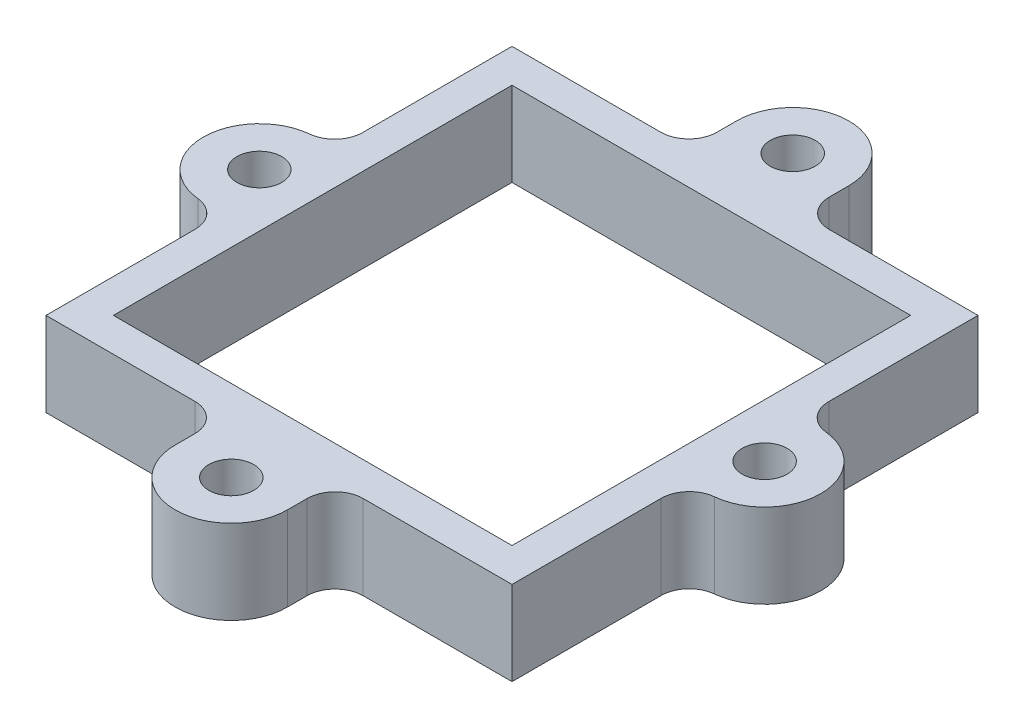
ISO-10303-21;
HEADER;
FILE_DESCRIPTION(('STEP AP214'),'2;1');
FILE_NAME('part.step','',(''),(''),'','','');
FILE_SCHEMA(('AUTOMOTIVE_DESIGN { 1 0 10303 214 1 1 1 1 }'));
ENDSEC;
DATA;
#1=APPLICATION_CONTEXT('core data for automotive mechanical design processes');
#2=APPLICATION_PROTOCOL_DEFINITION('international standard','automotive_design',2000,#1);
#3=PRODUCT_CONTEXT('',#1,'mechanical');
#4=PRODUCT('Part','Part','',(#3));
#5=PRODUCT_RELATED_PRODUCT_CATEGORY('part','',(#4));
#6=PRODUCT_DEFINITION_FORMATION('','',#4);
#7=PRODUCT_DEFINITION_CONTEXT('part definition',#1,'design');
#8=PRODUCT_DEFINITION('design','',#6,#7);
#9=PRODUCT_DEFINITION_SHAPE('','',#8);
#10=(LENGTH_UNIT() NAMED_UNIT(*) SI_UNIT(.MILLI.,.METRE.));
#11=(NAMED_UNIT(*) PLANE_ANGLE_UNIT() SI_UNIT($,.RADIAN.));
#12=(NAMED_UNIT(*) SI_UNIT($,.STERADIAN.) SOLID_ANGLE_UNIT());
#13=UNCERTAINTY_MEASURE_WITH_UNIT(LENGTH_MEASURE(1.E-05),#10,'distance_accuracy_value','');
#14=(GEOMETRIC_REPRESENTATION_CONTEXT(3) GLOBAL_UNCERTAINTY_ASSIGNED_CONTEXT((#13)) GLOBAL_UNIT_ASSIGNED_CONTEXT((#10,
#11,#12)) REPRESENTATION_CONTEXT('',''));
#15=CARTESIAN_POINT('',(0.,0.,0.));
#16=DIRECTION('',(0.,0.,1.));
#17=DIRECTION('',(1.,0.,0.));
#18=AXIS2_PLACEMENT_3D('',#15,#16,#17);
#19=CARTESIAN_POINT('',(-9.,3.,0.));
#20=DIRECTION('',(0.,1.,0.));
#21=DIRECTION('',(0.,0.,1.));
#22=AXIS2_PLACEMENT_3D('',#19,#20,#21);
#23=PLANE('',#22);
#24=CARTESIAN_POINT('',(0.,3.,-10.));
#25=DIRECTION('',(0.,1.,0.));
#26=DIRECTION('',(0.,0.,1.));
#27=AXIS2_PLACEMENT_3D('',#24,#25,#26);
#28=CIRCLE('',#27,0.8);
#29=CARTESIAN_POINT('',(0.,3.,-9.2));
#30=VERTEX_POINT('',#29);
#31=EDGE_CURVE('E1016',#30,#30,#28,.T.);
#32=ORIENTED_EDGE('',*,*,#31,.F.);
#33=EDGE_LOOP('',(#32));
#34=FACE_BOUND('',#33,.T.);
#35=CARTESIAN_POINT('',(9.,3.,0.));
#36=DIRECTION('',(0.,1.,0.));
#37=DIRECTION('',(0.,0.,1.));
#38=AXIS2_PLACEMENT_3D('',#35,#36,#37);
#39=CIRCLE('',#38,0.800000000000001);
#40=CARTESIAN_POINT('',(9.,3.,0.799999999999997));
#41=VERTEX_POINT('',#40);
#42=EDGE_CURVE('E1012',#41,#41,#39,.T.);
#43=ORIENTED_EDGE('',*,*,#42,.F.);
#44=EDGE_LOOP('',(#43));
#45=FACE_BOUND('',#44,.T.);
#46=CARTESIAN_POINT('',(0.,3.,10.));
#47=DIRECTION('',(0.,1.,0.));
#48=DIRECTION('',(0.,0.,1.));
#49=AXIS2_PLACEMENT_3D('',#46,#47,#48);
#50=CIRCLE('',#49,0.8);
#51=CARTESIAN_POINT('',(0.,3.,10.8));
#52=VERTEX_POINT('',#51);
#53=EDGE_CURVE('E1002',#52,#52,#50,.T.);
#54=ORIENTED_EDGE('',*,*,#53,.F.);
#55=EDGE_LOOP('',(#54));
#56=FACE_BOUND('',#55,.T.);
#57=CARTESIAN_POINT('',(-9.,3.,0.));
#58=DIRECTION('',(0.,1.,0.));
#59=DIRECTION('',(0.,0.,1.));
#60=AXIS2_PLACEMENT_3D('',#57,#58,#59);
#61=CIRCLE('',#60,0.800000000000001);
#62=CARTESIAN_POINT('',(-9.,3.,0.800000000000003));
#63=VERTEX_POINT('',#62);
#64=EDGE_CURVE('E994',#63,#63,#61,.T.);
#65=ORIENTED_EDGE('',*,*,#64,.F.);
#66=EDGE_LOOP('',(#65));
#67=FACE_BOUND('',#66,.T.);
#68=DIRECTION('',(0.,0.,1.));
#69=VECTOR('',#68,1.);
#70=CARTESIAN_POINT('',(-8.3,3.,-8.3));
#71=LINE('',#70,#69);
#72=CARTESIAN_POINT('',(-8.3,3.,-8.3));
#73=VERTEX_POINT('',#72);
#74=CARTESIAN_POINT('',(-8.3,3.,-2.98496231131986));
#75=VERTEX_POINT('',#74);
#76=EDGE_CURVE('E336',#73,#75,#71,.T.);
#77=ORIENTED_EDGE('',*,*,#76,.T.);
#78=CARTESIAN_POINT('',(-9.3,3.,-2.98496231131986));
#79=DIRECTION('',(0.,1.,0.));
#80=DIRECTION('',(0.,0.,1.));
#81=AXIS2_PLACEMENT_3D('',#78,#79,#80);
#82=CIRCLE('',#81,1.);
#83=CARTESIAN_POINT('',(-9.2,3.,-1.98997487421324));
#84=VERTEX_POINT('',#83);
#85=EDGE_CURVE('E520',#75,#84,#82,.F.);
#86=ORIENTED_EDGE('',*,*,#85,.T.);
#87=CARTESIAN_POINT('',(-9.,3.,0.));
#88=DIRECTION('',(0.,1.,0.));
#89=DIRECTION('',(0.,0.,1.));
#90=AXIS2_PLACEMENT_3D('',#87,#88,#89);
#91=CIRCLE('',#90,2.);
#92=CARTESIAN_POINT('',(-9.2,3.,1.98997487421324));
#93=VERTEX_POINT('',#92);
#94=EDGE_CURVE('E284',#84,#93,#91,.T.);
#95=ORIENTED_EDGE('',*,*,#94,.T.);
#96=CARTESIAN_POINT('',(-9.3,3.,2.98496231131986));
#97=DIRECTION('',(0.,1.,0.));
#98=DIRECTION('',(0.,0.,1.));
#99=AXIS2_PLACEMENT_3D('',#96,#97,#98);
#100=CIRCLE('',#99,1.);
#101=CARTESIAN_POINT('',(-8.3,3.,2.98496231131986));
#102=VERTEX_POINT('',#101);
#103=EDGE_CURVE('E11',#93,#102,#100,.F.);
#104=ORIENTED_EDGE('',*,*,#103,.T.);
#105=DIRECTION('',(0.,0.,1.));
#106=VECTOR('',#105,1.);
#107=CARTESIAN_POINT('',(-8.3,3.,2.));
#108=LINE('',#107,#106);
#109=CARTESIAN_POINT('',(-8.3,3.,8.3));
#110=VERTEX_POINT('',#109);
#111=EDGE_CURVE('E287',#102,#110,#108,.T.);
#112=ORIENTED_EDGE('',*,*,#111,.T.);
#113=DIRECTION('',(1.,0.,0.));
#114=VECTOR('',#113,1.);
#115=CARTESIAN_POINT('',(-8.3,3.,8.3));
#116=LINE('',#115,#114);
#117=CARTESIAN_POINT('',(-3.,3.,8.3));
#118=VERTEX_POINT('',#117);
#119=EDGE_CURVE('E291',#110,#118,#116,.T.);
#120=ORIENTED_EDGE('',*,*,#119,.T.);
#121=CARTESIAN_POINT('',(-3.,3.,9.3));
#122=DIRECTION('',(0.,1.,0.));
#123=DIRECTION('',(0.,0.,1.));
#124=AXIS2_PLACEMENT_3D('',#121,#122,#123);
#125=CIRCLE('',#124,1.);
#126=CARTESIAN_POINT('',(-2.,3.,9.3));
#127=VERTEX_POINT('',#126);
#128=EDGE_CURVE('E484',#118,#127,#125,.F.);
#129=ORIENTED_EDGE('',*,*,#128,.T.);
#130=DIRECTION('',(0.,0.,1.));
#131=VECTOR('',#130,1.);
#132=CARTESIAN_POINT('',(-2.,3.,10.));
#133=LINE('',#132,#131);
#134=CARTESIAN_POINT('',(-2.,3.,10.));
#135=VERTEX_POINT('',#134);
#136=EDGE_CURVE('E295',#127,#135,#133,.T.);
#137=ORIENTED_EDGE('',*,*,#136,.T.);
#138=CARTESIAN_POINT('',(0.,3.,10.));
#139=DIRECTION('',(0.,1.,0.));
#140=DIRECTION('',(0.,0.,1.));
#141=AXIS2_PLACEMENT_3D('',#138,#139,#140);
#142=CIRCLE('',#141,2.);
#143=CARTESIAN_POINT('',(2.,3.,10.));
#144=VERTEX_POINT('',#143);
#145=EDGE_CURVE('E298',#135,#144,#142,.T.);
#146=ORIENTED_EDGE('',*,*,#145,.T.);
#147=DIRECTION('',(0.,0.,-1.));
#148=VECTOR('',#147,1.);
#149=CARTESIAN_POINT('',(2.,3.,10.));
#150=LINE('',#149,#148);
#151=CARTESIAN_POINT('',(2.,3.,9.3));
#152=VERTEX_POINT('',#151);
#153=EDGE_CURVE('E301',#144,#152,#150,.T.);
#154=ORIENTED_EDGE('',*,*,#153,.T.);
#155=CARTESIAN_POINT('',(3.,3.,9.3));
#156=DIRECTION('',(0.,1.,0.));
#157=DIRECTION('',(0.,0.,1.));
#158=AXIS2_PLACEMENT_3D('',#155,#156,#157);
#159=CIRCLE('',#158,1.);
#160=CARTESIAN_POINT('',(3.,3.,8.3));
#161=VERTEX_POINT('',#160);
#162=EDGE_CURVE('E490',#152,#161,#159,.F.);
#163=ORIENTED_EDGE('',*,*,#162,.T.);
#164=DIRECTION('',(1.,0.,0.));
#165=VECTOR('',#164,1.);
#166=CARTESIAN_POINT('',(2.,3.,8.3));
#167=LINE('',#166,#165);
#168=CARTESIAN_POINT('',(8.3,3.,8.3));
#169=VERTEX_POINT('',#168);
#170=EDGE_CURVE('E305',#161,#169,#167,.T.);
#171=ORIENTED_EDGE('',*,*,#170,.T.);
#172=DIRECTION('',(0.,0.,-1.));
#173=VECTOR('',#172,1.);
#174=CARTESIAN_POINT('',(8.3,3.,2.));
#175=LINE('',#174,#173);
#176=CARTESIAN_POINT('',(8.3,3.,2.98496231131986));
#177=VERTEX_POINT('',#176);
#178=EDGE_CURVE('E308',#169,#177,#175,.T.);
#179=ORIENTED_EDGE('',*,*,#178,.T.);
#180=CARTESIAN_POINT('',(9.3,3.,2.98496231131986));
#181=DIRECTION('',(0.,1.,0.));
#182=DIRECTION('',(0.,0.,1.));
#183=AXIS2_PLACEMENT_3D('',#180,#181,#182);
#184=CIRCLE('',#183,1.);
#185=CARTESIAN_POINT('',(9.2,3.,1.98997487421324));
#186=VERTEX_POINT('',#185);
#187=EDGE_CURVE('E496',#177,#186,#184,.F.);
#188=ORIENTED_EDGE('',*,*,#187,.T.);
#189=CARTESIAN_POINT('',(9.,3.,0.));
#190=DIRECTION('',(0.,1.,0.));
#191=DIRECTION('',(0.,0.,1.));
#192=AXIS2_PLACEMENT_3D('',#189,#190,#191);
#193=CIRCLE('',#192,2.);
#194=CARTESIAN_POINT('',(9.2,3.,-1.98997487421324));
#195=VERTEX_POINT('',#194);
#196=EDGE_CURVE('E312',#186,#195,#193,.T.);
#197=ORIENTED_EDGE('',*,*,#196,.T.);
#198=CARTESIAN_POINT('',(9.3,3.,-2.98496231131986));
#199=DIRECTION('',(0.,1.,0.));
#200=DIRECTION('',(0.,0.,1.));
#201=AXIS2_PLACEMENT_3D('',#198,#199,#200);
#202=CIRCLE('',#201,1.);
#203=CARTESIAN_POINT('',(8.3,3.,-2.98496231131986));
#204=VERTEX_POINT('',#203);
#205=EDGE_CURVE('E502',#195,#204,#202,.F.);
#206=ORIENTED_EDGE('',*,*,#205,.T.);
#207=DIRECTION('',(0.,0.,-1.));
#208=VECTOR('',#207,1.);
#209=CARTESIAN_POINT('',(8.3,3.,-8.3));
#210=LINE('',#209,#208);
#211=CARTESIAN_POINT('',(8.3,3.,-8.3));
#212=VERTEX_POINT('',#211);
#213=EDGE_CURVE('E316',#204,#212,#210,.T.);
#214=ORIENTED_EDGE('',*,*,#213,.T.);
#215=DIRECTION('',(-1.,0.,0.));
#216=VECTOR('',#215,1.);
#217=CARTESIAN_POINT('',(2.,3.,-8.3));
#218=LINE('',#217,#216);
#219=CARTESIAN_POINT('',(3.,3.,-8.3));
#220=VERTEX_POINT('',#219);
#221=EDGE_CURVE('E319',#212,#220,#218,.T.);
#222=ORIENTED_EDGE('',*,*,#221,.T.);
#223=CARTESIAN_POINT('',(3.,3.,-9.3));
#224=DIRECTION('',(0.,1.,0.));
#225=DIRECTION('',(0.,0.,1.));
#226=AXIS2_PLACEMENT_3D('',#223,#224,#225);
#227=CIRCLE('',#226,1.);
#228=CARTESIAN_POINT('',(2.,3.,-9.3));
#229=VERTEX_POINT('',#228);
#230=EDGE_CURVE('E508',#220,#229,#227,.F.);
#231=ORIENTED_EDGE('',*,*,#230,.T.);
#232=DIRECTION('',(0.,0.,-1.));
#233=VECTOR('',#232,1.);
#234=CARTESIAN_POINT('',(2.,3.,-8.3));
#235=LINE('',#234,#233);
#236=CARTESIAN_POINT('',(2.,3.,-10.));
#237=VERTEX_POINT('',#236);
#238=EDGE_CURVE('E323',#229,#237,#235,.T.);
#239=ORIENTED_EDGE('',*,*,#238,.T.);
#240=CARTESIAN_POINT('',(0.,3.,-10.));
#241=DIRECTION('',(0.,1.,0.));
#242=DIRECTION('',(0.,0.,1.));
#243=AXIS2_PLACEMENT_3D('',#240,#241,#242);
#244=CIRCLE('',#243,2.);
#245=CARTESIAN_POINT('',(-2.,3.,-10.));
#246=VERTEX_POINT('',#245);
#247=EDGE_CURVE('E326',#237,#246,#244,.T.);
#248=ORIENTED_EDGE('',*,*,#247,.T.);
#249=DIRECTION('',(0.,0.,1.));
#250=VECTOR('',#249,1.);
#251=CARTESIAN_POINT('',(-2.,3.,-8.3));
#252=LINE('',#251,#250);
#253=CARTESIAN_POINT('',(-2.,3.,-9.3));
#254=VERTEX_POINT('',#253);
#255=EDGE_CURVE('E329',#246,#254,#252,.T.);
#256=ORIENTED_EDGE('',*,*,#255,.T.);
#257=CARTESIAN_POINT('',(-3.,3.,-9.3));
#258=DIRECTION('',(0.,1.,0.));
#259=DIRECTION('',(0.,0.,1.));
#260=AXIS2_PLACEMENT_3D('',#257,#258,#259);
#261=CIRCLE('',#260,1.);
#262=CARTESIAN_POINT('',(-3.,3.,-8.3));
#263=VERTEX_POINT('',#262);
#264=EDGE_CURVE('E514',#254,#263,#261,.F.);
#265=ORIENTED_EDGE('',*,*,#264,.T.);
#266=DIRECTION('',(-1.,0.,0.));
#267=VECTOR('',#266,1.);
#268=CARTESIAN_POINT('',(-8.3,3.,-8.3));
#269=LINE('',#268,#267);
#270=EDGE_CURVE('E333',#263,#73,#269,.T.);
#271=ORIENTED_EDGE('',*,*,#270,.T.);
#272=EDGE_LOOP('',(#77,#86,#95,#104,#112,#120,#129,#137,#146,#154,#163,#171,#179,#188,#197,#206,
#214,#222,#231,#239,#248,#256,#265,#271));
#273=FACE_BOUND('',#272,.T.);
#274=DIRECTION('',(-1.,0.,0.));
#275=VECTOR('',#274,1.);
#276=CARTESIAN_POINT('',(-7.1,3.,-7.1));
#277=LINE('',#276,#275);
#278=CARTESIAN_POINT('',(7.1,3.,-7.1));
#279=VERTEX_POINT('',#278);
#280=CARTESIAN_POINT('',(-7.1,3.,-7.1));
#281=VERTEX_POINT('',#280);
#282=EDGE_CURVE('E240',#279,#281,#277,.T.);
#283=ORIENTED_EDGE('',*,*,#282,.F.);
#284=DIRECTION('',(0.,0.,-1.));
#285=VECTOR('',#284,1.);
#286=CARTESIAN_POINT('',(7.1,3.,-7.1));
#287=LINE('',#286,#285);
#288=CARTESIAN_POINT('',(7.1,3.,7.1));
#289=VERTEX_POINT('',#288);
#290=EDGE_CURVE('E229',#289,#279,#287,.T.);
#291=ORIENTED_EDGE('',*,*,#290,.F.);
#292=DIRECTION('',(1.,0.,0.));
#293=VECTOR('',#292,1.);
#294=CARTESIAN_POINT('',(-7.1,3.,7.1));
#295=LINE('',#294,#293);
#296=CARTESIAN_POINT('',(-7.1,3.,7.1));
#297=VERTEX_POINT('',#296);
#298=EDGE_CURVE('E258',#297,#289,#295,.T.);
#299=ORIENTED_EDGE('',*,*,#298,.F.);
#300=DIRECTION('',(0.,0.,1.));
#301=VECTOR('',#300,1.);
#302=CARTESIAN_POINT('',(-7.1,3.,-7.1));
#303=LINE('',#302,#301);
#304=EDGE_CURVE('E254',#281,#297,#303,.T.);
#305=ORIENTED_EDGE('',*,*,#304,.F.);
#306=EDGE_LOOP('',(#283,#291,#299,#305));
#307=FACE_BOUND('',#306,.T.);
#308=ADVANCED_FACE('F43',(#34,#45,#56,#67,#273,#307),#23,.T.);
#309=CARTESIAN_POINT('',(-9.,0.,0.));
#310=DIRECTION('',(0.,1.,0.));
#311=DIRECTION('',(0.,0.,1.));
#312=AXIS2_PLACEMENT_3D('',#309,#310,#311);
#313=PLANE('',#312);
#314=CARTESIAN_POINT('',(0.,0.,-10.));
#315=DIRECTION('',(0.,1.,0.));
#316=DIRECTION('',(0.,0.,1.));
#317=AXIS2_PLACEMENT_3D('',#314,#315,#316);
#318=CIRCLE('',#317,0.8);
#319=CARTESIAN_POINT('',(0.,0.,-9.2));
#320=VERTEX_POINT('',#319);
#321=EDGE_CURVE('E267',#320,#320,#318,.T.);
#322=ORIENTED_EDGE('',*,*,#321,.T.);
#323=EDGE_LOOP('',(#322));
#324=FACE_BOUND('',#323,.T.);
#325=CARTESIAN_POINT('',(9.,0.,0.));
#326=DIRECTION('',(0.,1.,0.));
#327=DIRECTION('',(0.,0.,1.));
#328=AXIS2_PLACEMENT_3D('',#325,#326,#327);
#329=CIRCLE('',#328,0.800000000000001);
#330=CARTESIAN_POINT('',(9.,0.,0.799999999999997));
#331=VERTEX_POINT('',#330);
#332=EDGE_CURVE('E1008',#331,#331,#329,.T.);
#333=ORIENTED_EDGE('',*,*,#332,.T.);
#334=EDGE_LOOP('',(#333));
#335=FACE_BOUND('',#334,.T.);
#336=CARTESIAN_POINT('',(0.,0.,10.));
#337=DIRECTION('',(0.,1.,0.));
#338=DIRECTION('',(0.,0.,1.));
#339=AXIS2_PLACEMENT_3D('',#336,#337,#338);
#340=CIRCLE('',#339,0.8);
#341=CARTESIAN_POINT('',(0.,0.,10.8));
#342=VERTEX_POINT('',#341);
#343=EDGE_CURVE('E997',#342,#342,#340,.T.);
#344=ORIENTED_EDGE('',*,*,#343,.T.);
#345=EDGE_LOOP('',(#344));
#346=FACE_BOUND('',#345,.T.);
#347=CARTESIAN_POINT('',(-9.,0.,0.));
#348=DIRECTION('',(0.,1.,0.));
#349=DIRECTION('',(0.,0.,1.));
#350=AXIS2_PLACEMENT_3D('',#347,#348,#349);
#351=CIRCLE('',#350,0.800000000000001);
#352=CARTESIAN_POINT('',(-9.,0.,0.800000000000003));
#353=VERTEX_POINT('',#352);
#354=EDGE_CURVE('E991',#353,#353,#351,.T.);
#355=ORIENTED_EDGE('',*,*,#354,.T.);
#356=EDGE_LOOP('',(#355));
#357=FACE_BOUND('',#356,.T.);
#358=CARTESIAN_POINT('',(-9.,0.,0.));
#359=DIRECTION('',(0.,1.,0.));
#360=DIRECTION('',(0.,0.,1.));
#361=AXIS2_PLACEMENT_3D('',#358,#359,#360);
#362=CIRCLE('',#361,2.);
#363=CARTESIAN_POINT('',(-9.2,0.,-1.98997487421324));
#364=VERTEX_POINT('',#363);
#365=CARTESIAN_POINT('',(-9.2,0.,1.98997487421324));
#366=VERTEX_POINT('',#365);
#367=EDGE_CURVE('E249',#364,#366,#362,.T.);
#368=ORIENTED_EDGE('',*,*,#367,.F.);
#369=CARTESIAN_POINT('',(-9.3,0.,-2.98496231131986));
#370=DIRECTION('',(0.,1.,0.));
#371=DIRECTION('',(0.,0.,1.));
#372=AXIS2_PLACEMENT_3D('',#369,#370,#371);
#373=CIRCLE('',#372,1.);
#374=CARTESIAN_POINT('',(-8.3,0.,-2.98496231131986));
#375=VERTEX_POINT('',#374);
#376=EDGE_CURVE('E517',#364,#375,#373,.T.);
#377=ORIENTED_EDGE('',*,*,#376,.T.);
#378=DIRECTION('',(0.,0.,1.));
#379=VECTOR('',#378,1.);
#380=CARTESIAN_POINT('',(-8.3,0.,-8.3));
#381=LINE('',#380,#379);
#382=CARTESIAN_POINT('',(-8.3,0.,-8.3));
#383=VERTEX_POINT('',#382);
#384=EDGE_CURVE('E288',#383,#375,#381,.T.);
#385=ORIENTED_EDGE('',*,*,#384,.F.);
#386=DIRECTION('',(-1.,0.,0.));
#387=VECTOR('',#386,1.);
#388=CARTESIAN_POINT('',(-8.3,0.,-8.3));
#389=LINE('',#388,#387);
#390=CARTESIAN_POINT('',(-3.,0.,-8.3));
#391=VERTEX_POINT('',#390);
#392=EDGE_CURVE('E389',#391,#383,#389,.T.);
#393=ORIENTED_EDGE('',*,*,#392,.F.);
#394=CARTESIAN_POINT('',(-3.,0.,-9.3));
#395=DIRECTION('',(0.,1.,0.));
#396=DIRECTION('',(0.,0.,1.));
#397=AXIS2_PLACEMENT_3D('',#394,#395,#396);
#398=CIRCLE('',#397,1.);
#399=CARTESIAN_POINT('',(-2.,0.,-9.3));
#400=VERTEX_POINT('',#399);
#401=EDGE_CURVE('E511',#391,#400,#398,.T.);
#402=ORIENTED_EDGE('',*,*,#401,.T.);
#403=DIRECTION('',(0.,0.,1.));
#404=VECTOR('',#403,1.);
#405=CARTESIAN_POINT('',(-2.,0.,-8.3));
#406=LINE('',#405,#404);
#407=CARTESIAN_POINT('',(-2.,0.,-10.));
#408=VERTEX_POINT('',#407);
#409=EDGE_CURVE('E385',#408,#400,#406,.T.);
#410=ORIENTED_EDGE('',*,*,#409,.F.);
#411=CARTESIAN_POINT('',(0.,0.,-10.));
#412=DIRECTION('',(0.,1.,0.));
#413=DIRECTION('',(0.,0.,1.));
#414=AXIS2_PLACEMENT_3D('',#411,#412,#413);
#415=CIRCLE('',#414,2.);
#416=CARTESIAN_POINT('',(2.,0.,-10.));
#417=VERTEX_POINT('',#416);
#418=EDGE_CURVE('E382',#417,#408,#415,.T.);
#419=ORIENTED_EDGE('',*,*,#418,.F.);
#420=DIRECTION('',(0.,0.,-1.));
#421=VECTOR('',#420,1.);
#422=CARTESIAN_POINT('',(2.,0.,-8.3));
#423=LINE('',#422,#421);
#424=CARTESIAN_POINT('',(2.,0.,-9.3));
#425=VERTEX_POINT('',#424);
#426=EDGE_CURVE('E379',#425,#417,#423,.T.);
#427=ORIENTED_EDGE('',*,*,#426,.F.);
#428=CARTESIAN_POINT('',(3.,0.,-9.3));
#429=DIRECTION('',(0.,1.,0.));
#430=DIRECTION('',(0.,0.,1.));
#431=AXIS2_PLACEMENT_3D('',#428,#429,#430);
#432=CIRCLE('',#431,1.);
#433=CARTESIAN_POINT('',(3.,0.,-8.3));
#434=VERTEX_POINT('',#433);
#435=EDGE_CURVE('E505',#425,#434,#432,.T.);
#436=ORIENTED_EDGE('',*,*,#435,.T.);
#437=DIRECTION('',(-1.,0.,0.));
#438=VECTOR('',#437,1.);
#439=CARTESIAN_POINT('',(2.,0.,-8.3));
#440=LINE('',#439,#438);
#441=CARTESIAN_POINT('',(8.3,0.,-8.3));
#442=VERTEX_POINT('',#441);
#443=EDGE_CURVE('E375',#442,#434,#440,.T.);
#444=ORIENTED_EDGE('',*,*,#443,.F.);
#445=DIRECTION('',(0.,0.,-1.));
#446=VECTOR('',#445,1.);
#447=CARTESIAN_POINT('',(8.3,0.,-8.3));
#448=LINE('',#447,#446);
#449=CARTESIAN_POINT('',(8.3,0.,-2.98496231131986));
#450=VERTEX_POINT('',#449);
#451=EDGE_CURVE('E372',#450,#442,#448,.T.);
#452=ORIENTED_EDGE('',*,*,#451,.F.);
#453=CARTESIAN_POINT('',(9.3,0.,-2.98496231131986));
#454=DIRECTION('',(0.,1.,0.));
#455=DIRECTION('',(0.,0.,1.));
#456=AXIS2_PLACEMENT_3D('',#453,#454,#455);
#457=CIRCLE('',#456,1.);
#458=CARTESIAN_POINT('',(9.2,0.,-1.98997487421324));
#459=VERTEX_POINT('',#458);
#460=EDGE_CURVE('E499',#450,#459,#457,.T.);
#461=ORIENTED_EDGE('',*,*,#460,.T.);
#462=CARTESIAN_POINT('',(9.,0.,0.));
#463=DIRECTION('',(0.,1.,0.));
#464=DIRECTION('',(0.,0.,1.));
#465=AXIS2_PLACEMENT_3D('',#462,#463,#464);
#466=CIRCLE('',#465,2.);
#467=CARTESIAN_POINT('',(9.2,0.,1.98997487421324));
#468=VERTEX_POINT('',#467);
#469=EDGE_CURVE('E368',#468,#459,#466,.T.);
#470=ORIENTED_EDGE('',*,*,#469,.F.);
#471=CARTESIAN_POINT('',(9.3,0.,2.98496231131986));
#472=DIRECTION('',(0.,1.,0.));
#473=DIRECTION('',(0.,0.,1.));
#474=AXIS2_PLACEMENT_3D('',#471,#472,#473);
#475=CIRCLE('',#474,1.);
#476=CARTESIAN_POINT('',(8.3,0.,2.98496231131986));
#477=VERTEX_POINT('',#476);
#478=EDGE_CURVE('E493',#468,#477,#475,.T.);
#479=ORIENTED_EDGE('',*,*,#478,.T.);
#480=DIRECTION('',(0.,0.,-1.));
#481=VECTOR('',#480,1.);
#482=CARTESIAN_POINT('',(8.3,0.,2.));
#483=LINE('',#482,#481);
#484=CARTESIAN_POINT('',(8.3,0.,8.3));
#485=VERTEX_POINT('',#484);
#486=EDGE_CURVE('E364',#485,#477,#483,.T.);
#487=ORIENTED_EDGE('',*,*,#486,.F.);
#488=DIRECTION('',(1.,0.,0.));
#489=VECTOR('',#488,1.);
#490=CARTESIAN_POINT('',(2.,0.,8.3));
#491=LINE('',#490,#489);
#492=CARTESIAN_POINT('',(3.,0.,8.3));
#493=VERTEX_POINT('',#492);
#494=EDGE_CURVE('E361',#493,#485,#491,.T.);
#495=ORIENTED_EDGE('',*,*,#494,.F.);
#496=CARTESIAN_POINT('',(3.,0.,9.3));
#497=DIRECTION('',(0.,1.,0.));
#498=DIRECTION('',(0.,0.,1.));
#499=AXIS2_PLACEMENT_3D('',#496,#497,#498);
#500=CIRCLE('',#499,1.);
#501=CARTESIAN_POINT('',(2.,0.,9.3));
#502=VERTEX_POINT('',#501);
#503=EDGE_CURVE('E487',#493,#502,#500,.T.);
#504=ORIENTED_EDGE('',*,*,#503,.T.);
#505=DIRECTION('',(0.,0.,-1.));
#506=VECTOR('',#505,1.);
#507=CARTESIAN_POINT('',(2.,0.,10.));
#508=LINE('',#507,#506);
#509=CARTESIAN_POINT('',(2.,0.,10.));
#510=VERTEX_POINT('',#509);
#511=EDGE_CURVE('E357',#510,#502,#508,.T.);
#512=ORIENTED_EDGE('',*,*,#511,.F.);
#513=CARTESIAN_POINT('',(0.,0.,10.));
#514=DIRECTION('',(0.,1.,0.));
#515=DIRECTION('',(0.,0.,1.));
#516=AXIS2_PLACEMENT_3D('',#513,#514,#515);
#517=CIRCLE('',#516,2.);
#518=CARTESIAN_POINT('',(-2.,0.,10.));
#519=VERTEX_POINT('',#518);
#520=EDGE_CURVE('E354',#519,#510,#517,.T.);
#521=ORIENTED_EDGE('',*,*,#520,.F.);
#522=DIRECTION('',(0.,0.,1.));
#523=VECTOR('',#522,1.);
#524=CARTESIAN_POINT('',(-2.,0.,10.));
#525=LINE('',#524,#523);
#526=CARTESIAN_POINT('',(-2.,0.,9.3));
#527=VERTEX_POINT('',#526);
#528=EDGE_CURVE('E351',#527,#519,#525,.T.);
#529=ORIENTED_EDGE('',*,*,#528,.F.);
#530=CARTESIAN_POINT('',(-3.,0.,9.3));
#531=DIRECTION('',(0.,1.,0.));
#532=DIRECTION('',(0.,0.,1.));
#533=AXIS2_PLACEMENT_3D('',#530,#531,#532);
#534=CIRCLE('',#533,1.);
#535=CARTESIAN_POINT('',(-3.,0.,8.3));
#536=VERTEX_POINT('',#535);
#537=EDGE_CURVE('E481',#527,#536,#534,.T.);
#538=ORIENTED_EDGE('',*,*,#537,.T.);
#539=DIRECTION('',(1.,0.,0.));
#540=VECTOR('',#539,1.);
#541=CARTESIAN_POINT('',(-8.3,0.,8.3));
#542=LINE('',#541,#540);
#543=CARTESIAN_POINT('',(-8.3,0.,8.3));
#544=VERTEX_POINT('',#543);
#545=EDGE_CURVE('E347',#544,#536,#542,.T.);
#546=ORIENTED_EDGE('',*,*,#545,.F.);
#547=DIRECTION('',(0.,0.,1.));
#548=VECTOR('',#547,1.);
#549=CARTESIAN_POINT('',(-8.3,0.,2.));
#550=LINE('',#549,#548);
#551=CARTESIAN_POINT('',(-8.3,0.,2.98496231131986));
#552=VERTEX_POINT('',#551);
#553=EDGE_CURVE('E344',#552,#544,#550,.T.);
#554=ORIENTED_EDGE('',*,*,#553,.F.);
#555=CARTESIAN_POINT('',(-9.3,0.,2.98496231131986));
#556=DIRECTION('',(0.,1.,0.));
#557=DIRECTION('',(0.,0.,1.));
#558=AXIS2_PLACEMENT_3D('',#555,#556,#557);
#559=CIRCLE('',#558,1.);
#560=EDGE_CURVE('E52',#552,#366,#559,.T.);
#561=ORIENTED_EDGE('',*,*,#560,.T.);
#562=EDGE_LOOP('',(#368,#377,#385,#393,#402,#410,#419,#427,#436,#444,#452,#461,#470,#479,#487,
#495,#504,#512,#521,#529,#538,#546,#554,#561));
#563=FACE_BOUND('',#562,.T.);
#564=DIRECTION('',(0.,0.,-1.));
#565=VECTOR('',#564,1.);
#566=CARTESIAN_POINT('',(7.1,0.,-7.1));
#567=LINE('',#566,#565);
#568=CARTESIAN_POINT('',(7.1,0.,7.1));
#569=VERTEX_POINT('',#568);
#570=CARTESIAN_POINT('',(7.1,0.,-7.1));
#571=VERTEX_POINT('',#570);
#572=EDGE_CURVE('E264',#569,#571,#567,.T.);
#573=ORIENTED_EDGE('',*,*,#572,.T.);
#574=DIRECTION('',(-1.,0.,0.));
#575=VECTOR('',#574,1.);
#576=CARTESIAN_POINT('',(-7.1,0.,-7.1));
#577=LINE('',#576,#575);
#578=CARTESIAN_POINT('',(-7.1,0.,-7.1));
#579=VERTEX_POINT('',#578);
#580=EDGE_CURVE('E247',#571,#579,#577,.T.);
#581=ORIENTED_EDGE('',*,*,#580,.T.);
#582=DIRECTION('',(0.,0.,1.));
#583=VECTOR('',#582,1.);
#584=CARTESIAN_POINT('',(-7.1,0.,-7.1));
#585=LINE('',#584,#583);
#586=CARTESIAN_POINT('',(-7.1,0.,7.1));
#587=VERTEX_POINT('',#586);
#588=EDGE_CURVE('E270',#579,#587,#585,.T.);
#589=ORIENTED_EDGE('',*,*,#588,.T.);
#590=DIRECTION('',(1.,0.,0.));
#591=VECTOR('',#590,1.);
#592=CARTESIAN_POINT('',(-7.1,0.,7.1));
#593=LINE('',#592,#591);
#594=EDGE_CURVE('E241',#587,#569,#593,.T.);
#595=ORIENTED_EDGE('',*,*,#594,.T.);
#596=EDGE_LOOP('',(#573,#581,#589,#595));
#597=FACE_BOUND('',#596,.T.);
#598=ADVANCED_FACE('F526',(#324,#335,#346,#357,#563,#597),#313,.F.);
#599=CARTESIAN_POINT('',(-9.,3.,0.));
#600=DIRECTION('',(0.,-1.,0.));
#601=DIRECTION('',(0.,0.,-1.));
#602=AXIS2_PLACEMENT_3D('',#599,#600,#601);
#603=CYLINDRICAL_SURFACE('',#602,2.);
#604=ORIENTED_EDGE('',*,*,#94,.F.);
#605=DIRECTION('',(0.,-1.,0.));
#606=VECTOR('',#605,1.);
#607=CARTESIAN_POINT('',(-9.2,3.,-1.98997487421324));
#608=LINE('',#607,#606);
#609=EDGE_CURVE('E471',#84,#364,#608,.T.);
#610=ORIENTED_EDGE('',*,*,#609,.T.);
#611=ORIENTED_EDGE('',*,*,#367,.T.);
#612=DIRECTION('',(0.,-1.,0.));
#613=VECTOR('',#612,1.);
#614=CARTESIAN_POINT('',(-9.2,3.,1.98997487421324));
#615=LINE('',#614,#613);
#616=EDGE_CURVE('E468',#366,#93,#615,.F.);
#617=ORIENTED_EDGE('',*,*,#616,.T.);
#618=EDGE_LOOP('',(#604,#610,#611,#617));
#619=FACE_BOUND('',#618,.T.);
#620=ADVANCED_FACE('F531',(#619),#603,.T.);
#621=CARTESIAN_POINT('',(-8.3,3.,2.));
#622=DIRECTION('',(1.,0.,0.));
#623=DIRECTION('',(0.,0.,-1.));
#624=AXIS2_PLACEMENT_3D('',#621,#622,#623);
#625=PLANE('',#624);
#626=ORIENTED_EDGE('',*,*,#111,.F.);
#627=DIRECTION('',(0.,1.,0.));
#628=VECTOR('',#627,1.);
#629=CARTESIAN_POINT('',(-8.3,0.,2.98496231131986));
#630=LINE('',#629,#628);
#631=EDGE_CURVE('E478',#102,#552,#630,.F.);
#632=ORIENTED_EDGE('',*,*,#631,.T.);
#633=ORIENTED_EDGE('',*,*,#553,.T.);
#634=DIRECTION('',(0.,-1.,0.));
#635=VECTOR('',#634,1.);
#636=CARTESIAN_POINT('',(-8.3,3.,8.3));
#637=LINE('',#636,#635);
#638=EDGE_CURVE('E422',#110,#544,#637,.T.);
#639=ORIENTED_EDGE('',*,*,#638,.F.);
#640=EDGE_LOOP('',(#626,#632,#633,#639));
#641=FACE_BOUND('',#640,.T.);
#642=ADVANCED_FACE('F534',(#641),#625,.F.);
#643=CARTESIAN_POINT('',(-8.3,3.,8.3));
#644=DIRECTION('',(0.,0.,-1.));
#645=DIRECTION('',(-1.,0.,0.));
#646=AXIS2_PLACEMENT_3D('',#643,#644,#645);
#647=PLANE('',#646);
#648=ORIENTED_EDGE('',*,*,#545,.T.);
#649=DIRECTION('',(0.,-1.,0.));
#650=VECTOR('',#649,1.);
#651=CARTESIAN_POINT('',(-3.,3.,8.3));
#652=LINE('',#651,#650);
#653=EDGE_CURVE('E430',#536,#118,#652,.F.);
#654=ORIENTED_EDGE('',*,*,#653,.T.);
#655=ORIENTED_EDGE('',*,*,#119,.F.);
#656=ORIENTED_EDGE('',*,*,#638,.T.);
#657=EDGE_LOOP('',(#648,#654,#655,#656));
#658=FACE_BOUND('',#657,.T.);
#659=ADVANCED_FACE('F676',(#658),#647,.F.);
#660=CARTESIAN_POINT('',(-2.,3.,10.));
#661=DIRECTION('',(1.,0.,0.));
#662=DIRECTION('',(0.,0.,-1.));
#663=AXIS2_PLACEMENT_3D('',#660,#661,#662);
#664=PLANE('',#663);
#665=ORIENTED_EDGE('',*,*,#136,.F.);
#666=DIRECTION('',(0.,-1.,0.));
#667=VECTOR('',#666,1.);
#668=CARTESIAN_POINT('',(-2.,0.,9.3));
#669=LINE('',#668,#667);
#670=EDGE_CURVE('E426',#127,#527,#669,.T.);
#671=ORIENTED_EDGE('',*,*,#670,.T.);
#672=ORIENTED_EDGE('',*,*,#528,.T.);
#673=DIRECTION('',(0.,-1.,0.));
#674=VECTOR('',#673,1.);
#675=CARTESIAN_POINT('',(-2.,3.,10.));
#676=LINE('',#675,#674);
#677=EDGE_CURVE('E418',#135,#519,#676,.T.);
#678=ORIENTED_EDGE('',*,*,#677,.F.);
#679=EDGE_LOOP('',(#665,#671,#672,#678));
#680=FACE_BOUND('',#679,.T.);
#681=ADVANCED_FACE('F546',(#680),#664,.F.);
#682=CARTESIAN_POINT('',(0.,3.,10.));
#683=DIRECTION('',(0.,-1.,0.));
#684=DIRECTION('',(0.,0.,-1.));
#685=AXIS2_PLACEMENT_3D('',#682,#683,#684);
#686=CYLINDRICAL_SURFACE('',#685,2.);
#687=ORIENTED_EDGE('',*,*,#520,.T.);
#688=DIRECTION('',(0.,-1.,0.));
#689=VECTOR('',#688,1.);
#690=CARTESIAN_POINT('',(2.,3.,10.));
#691=LINE('',#690,#689);
#692=EDGE_CURVE('E414',#144,#510,#691,.T.);
#693=ORIENTED_EDGE('',*,*,#692,.F.);
#694=ORIENTED_EDGE('',*,*,#145,.F.);
#695=ORIENTED_EDGE('',*,*,#677,.T.);
#696=EDGE_LOOP('',(#687,#693,#694,#695));
#697=FACE_BOUND('',#696,.T.);
#698=ADVANCED_FACE('F552',(#697),#686,.T.);
#699=CARTESIAN_POINT('',(2.,3.,10.));
#700=DIRECTION('',(-1.,0.,0.));
#701=DIRECTION('',(0.,0.,1.));
#702=AXIS2_PLACEMENT_3D('',#699,#700,#701);
#703=PLANE('',#702);
#704=ORIENTED_EDGE('',*,*,#511,.T.);
#705=DIRECTION('',(0.,-1.,0.));
#706=VECTOR('',#705,1.);
#707=CARTESIAN_POINT('',(2.,3.,9.3));
#708=LINE('',#707,#706);
#709=EDGE_CURVE('E437',#502,#152,#708,.F.);
#710=ORIENTED_EDGE('',*,*,#709,.T.);
#711=ORIENTED_EDGE('',*,*,#153,.F.);
#712=ORIENTED_EDGE('',*,*,#692,.T.);
#713=EDGE_LOOP('',(#704,#710,#711,#712));
#714=FACE_BOUND('',#713,.T.);
#715=ADVANCED_FACE('F556',(#714),#703,.F.);
#716=CARTESIAN_POINT('',(2.,3.,8.3));
#717=DIRECTION('',(0.,0.,-1.));
#718=DIRECTION('',(-1.,0.,0.));
#719=AXIS2_PLACEMENT_3D('',#716,#717,#718);
#720=PLANE('',#719);
#721=ORIENTED_EDGE('',*,*,#170,.F.);
#722=DIRECTION('',(0.,-1.,0.));
#723=VECTOR('',#722,1.);
#724=CARTESIAN_POINT('',(3.,0.,8.3));
#725=LINE('',#724,#723);
#726=EDGE_CURVE('E433',#161,#493,#725,.T.);
#727=ORIENTED_EDGE('',*,*,#726,.T.);
#728=ORIENTED_EDGE('',*,*,#494,.T.);
#729=DIRECTION('',(0.,-1.,0.));
#730=VECTOR('',#729,1.);
#731=CARTESIAN_POINT('',(8.3,3.,8.3));
#732=LINE('',#731,#730);
#733=EDGE_CURVE('E410',#169,#485,#732,.T.);
#734=ORIENTED_EDGE('',*,*,#733,.F.);
#735=EDGE_LOOP('',(#721,#727,#728,#734));
#736=FACE_BOUND('',#735,.T.);
#737=ADVANCED_FACE('F565',(#736),#720,.F.);
#738=CARTESIAN_POINT('',(8.3,3.,2.));
#739=DIRECTION('',(-1.,0.,0.));
#740=DIRECTION('',(0.,0.,1.));
#741=AXIS2_PLACEMENT_3D('',#738,#739,#740);
#742=PLANE('',#741);
#743=ORIENTED_EDGE('',*,*,#486,.T.);
#744=DIRECTION('',(0.,1.,0.));
#745=VECTOR('',#744,1.);
#746=CARTESIAN_POINT('',(8.3,3.,2.98496231131986));
#747=LINE('',#746,#745);
#748=EDGE_CURVE('E447',#477,#177,#747,.T.);
#749=ORIENTED_EDGE('',*,*,#748,.T.);
#750=ORIENTED_EDGE('',*,*,#178,.F.);
#751=ORIENTED_EDGE('',*,*,#733,.T.);
#752=EDGE_LOOP('',(#743,#749,#750,#751));
#753=FACE_BOUND('',#752,.T.);
#754=ADVANCED_FACE('F571',(#753),#742,.F.);
#755=CARTESIAN_POINT('',(9.,3.,0.));
#756=DIRECTION('',(0.,-1.,0.));
#757=DIRECTION('',(0.,0.,-1.));
#758=AXIS2_PLACEMENT_3D('',#755,#756,#757);
#759=CYLINDRICAL_SURFACE('',#758,2.);
#760=ORIENTED_EDGE('',*,*,#196,.F.);
#761=DIRECTION('',(0.,-1.,0.));
#762=VECTOR('',#761,1.);
#763=CARTESIAN_POINT('',(9.2,3.,1.98997487421324));
#764=LINE('',#763,#762);
#765=EDGE_CURVE('E443',#186,#468,#764,.T.);
#766=ORIENTED_EDGE('',*,*,#765,.T.);
#767=ORIENTED_EDGE('',*,*,#469,.T.);
#768=DIRECTION('',(0.,-1.,0.));
#769=VECTOR('',#768,1.);
#770=CARTESIAN_POINT('',(9.2,3.,-1.98997487421324));
#771=LINE('',#770,#769);
#772=EDGE_CURVE('E440',#459,#195,#771,.F.);
#773=ORIENTED_EDGE('',*,*,#772,.T.);
#774=EDGE_LOOP('',(#760,#766,#767,#773));
#775=FACE_BOUND('',#774,.T.);
#776=ADVANCED_FACE('F580',(#775),#759,.T.);
#777=CARTESIAN_POINT('',(8.3,3.,-8.3));
#778=DIRECTION('',(-1.,0.,0.));
#779=DIRECTION('',(0.,0.,1.));
#780=AXIS2_PLACEMENT_3D('',#777,#778,#779);
#781=PLANE('',#780);
#782=ORIENTED_EDGE('',*,*,#213,.F.);
#783=DIRECTION('',(0.,1.,0.));
#784=VECTOR('',#783,1.);
#785=CARTESIAN_POINT('',(8.3,0.,-2.98496231131986));
#786=LINE('',#785,#784);
#787=EDGE_CURVE('E450',#204,#450,#786,.F.);
#788=ORIENTED_EDGE('',*,*,#787,.T.);
#789=ORIENTED_EDGE('',*,*,#451,.T.);
#790=DIRECTION('',(0.,-1.,0.));
#791=VECTOR('',#790,1.);
#792=CARTESIAN_POINT('',(8.3,3.,-8.3));
#793=LINE('',#792,#791);
#794=EDGE_CURVE('E406',#212,#442,#793,.T.);
#795=ORIENTED_EDGE('',*,*,#794,.F.);
#796=EDGE_LOOP('',(#782,#788,#789,#795));
#797=FACE_BOUND('',#796,.T.);
#798=ADVANCED_FACE('F588',(#797),#781,.F.);
#799=CARTESIAN_POINT('',(2.,3.,-8.3));
#800=DIRECTION('',(0.,0.,1.));
#801=DIRECTION('',(1.,0.,0.));
#802=AXIS2_PLACEMENT_3D('',#799,#800,#801);
#803=PLANE('',#802);
#804=ORIENTED_EDGE('',*,*,#443,.T.);
#805=DIRECTION('',(0.,-1.,0.));
#806=VECTOR('',#805,1.);
#807=CARTESIAN_POINT('',(3.,3.,-8.3));
#808=LINE('',#807,#806);
#809=EDGE_CURVE('E458',#434,#220,#808,.F.);
#810=ORIENTED_EDGE('',*,*,#809,.T.);
#811=ORIENTED_EDGE('',*,*,#221,.F.);
#812=ORIENTED_EDGE('',*,*,#794,.T.);
#813=EDGE_LOOP('',(#804,#810,#811,#812));
#814=FACE_BOUND('',#813,.T.);
#815=ADVANCED_FACE('F593',(#814),#803,.F.);
#816=CARTESIAN_POINT('',(2.,3.,-8.3));
#817=DIRECTION('',(-1.,0.,0.));
#818=DIRECTION('',(0.,0.,1.));
#819=AXIS2_PLACEMENT_3D('',#816,#817,#818);
#820=PLANE('',#819);
#821=ORIENTED_EDGE('',*,*,#238,.F.);
#822=DIRECTION('',(0.,-1.,0.));
#823=VECTOR('',#822,1.);
#824=CARTESIAN_POINT('',(2.,0.,-9.3));
#825=LINE('',#824,#823);
#826=EDGE_CURVE('E454',#229,#425,#825,.T.);
#827=ORIENTED_EDGE('',*,*,#826,.T.);
#828=ORIENTED_EDGE('',*,*,#426,.T.);
#829=DIRECTION('',(0.,-1.,0.));
#830=VECTOR('',#829,1.);
#831=CARTESIAN_POINT('',(2.,3.,-10.));
#832=LINE('',#831,#830);
#833=EDGE_CURVE('E402',#237,#417,#832,.T.);
#834=ORIENTED_EDGE('',*,*,#833,.F.);
#835=EDGE_LOOP('',(#821,#827,#828,#834));
#836=FACE_BOUND('',#835,.T.);
#837=ADVANCED_FACE('F602',(#836),#820,.F.);
#838=CARTESIAN_POINT('',(0.,3.,-10.));
#839=DIRECTION('',(0.,-1.,0.));
#840=DIRECTION('',(0.,0.,-1.));
#841=AXIS2_PLACEMENT_3D('',#838,#839,#840);
#842=CYLINDRICAL_SURFACE('',#841,2.);
#843=ORIENTED_EDGE('',*,*,#418,.T.);
#844=DIRECTION('',(0.,-1.,0.));
#845=VECTOR('',#844,1.);
#846=CARTESIAN_POINT('',(-2.,3.,-10.));
#847=LINE('',#846,#845);
#848=EDGE_CURVE('E398',#246,#408,#847,.T.);
#849=ORIENTED_EDGE('',*,*,#848,.F.);
#850=ORIENTED_EDGE('',*,*,#247,.F.);
#851=ORIENTED_EDGE('',*,*,#833,.T.);
#852=EDGE_LOOP('',(#843,#849,#850,#851));
#853=FACE_BOUND('',#852,.T.);
#854=ADVANCED_FACE('F608',(#853),#842,.T.);
#855=CARTESIAN_POINT('',(-2.,3.,-8.3));
#856=DIRECTION('',(1.,0.,0.));
#857=DIRECTION('',(0.,0.,-1.));
#858=AXIS2_PLACEMENT_3D('',#855,#856,#857);
#859=PLANE('',#858);
#860=ORIENTED_EDGE('',*,*,#409,.T.);
#861=DIRECTION('',(0.,-1.,0.));
#862=VECTOR('',#861,1.);
#863=CARTESIAN_POINT('',(-2.,3.,-9.3));
#864=LINE('',#863,#862);
#865=EDGE_CURVE('E465',#400,#254,#864,.F.);
#866=ORIENTED_EDGE('',*,*,#865,.T.);
#867=ORIENTED_EDGE('',*,*,#255,.F.);
#868=ORIENTED_EDGE('',*,*,#848,.T.);
#869=EDGE_LOOP('',(#860,#866,#867,#868));
#870=FACE_BOUND('',#869,.T.);
#871=ADVANCED_FACE('F612',(#870),#859,.F.);
#872=CARTESIAN_POINT('',(-8.3,3.,-8.3));
#873=DIRECTION('',(0.,0.,1.));
#874=DIRECTION('',(1.,0.,0.));
#875=AXIS2_PLACEMENT_3D('',#872,#873,#874);
#876=PLANE('',#875);
#877=ORIENTED_EDGE('',*,*,#270,.F.);
#878=DIRECTION('',(0.,-1.,0.));
#879=VECTOR('',#878,1.);
#880=CARTESIAN_POINT('',(-3.,0.,-8.3));
#881=LINE('',#880,#879);
#882=EDGE_CURVE('E461',#263,#391,#881,.T.);
#883=ORIENTED_EDGE('',*,*,#882,.T.);
#884=ORIENTED_EDGE('',*,*,#392,.T.);
#885=DIRECTION('',(0.,-1.,0.));
#886=VECTOR('',#885,1.);
#887=CARTESIAN_POINT('',(-8.3,3.,-8.3));
#888=LINE('',#887,#886);
#889=EDGE_CURVE('E340',#73,#383,#888,.T.);
#890=ORIENTED_EDGE('',*,*,#889,.F.);
#891=EDGE_LOOP('',(#877,#883,#884,#890));
#892=FACE_BOUND('',#891,.T.);
#893=ADVANCED_FACE('F621',(#892),#876,.F.);
#894=CARTESIAN_POINT('',(-8.3,3.,-8.3));
#895=DIRECTION('',(1.,0.,0.));
#896=DIRECTION('',(0.,0.,-1.));
#897=AXIS2_PLACEMENT_3D('',#894,#895,#896);
#898=PLANE('',#897);
#899=ORIENTED_EDGE('',*,*,#384,.T.);
#900=DIRECTION('',(0.,1.,0.));
#901=VECTOR('',#900,1.);
#902=CARTESIAN_POINT('',(-8.3,3.,-2.98496231131986));
#903=LINE('',#902,#901);
#904=EDGE_CURVE('E475',#375,#75,#903,.T.);
#905=ORIENTED_EDGE('',*,*,#904,.T.);
#906=ORIENTED_EDGE('',*,*,#76,.F.);
#907=ORIENTED_EDGE('',*,*,#889,.T.);
#908=EDGE_LOOP('',(#899,#905,#906,#907));
#909=FACE_BOUND('',#908,.T.);
#910=ADVANCED_FACE('F626',(#909),#898,.F.);
#911=CARTESIAN_POINT('',(7.1,3.,-7.1));
#912=DIRECTION('',(-1.,0.,0.));
#913=DIRECTION('',(0.,0.,1.));
#914=AXIS2_PLACEMENT_3D('',#911,#912,#913);
#915=PLANE('',#914);
#916=ORIENTED_EDGE('',*,*,#572,.F.);
#917=DIRECTION('',(0.,-1.,0.));
#918=VECTOR('',#917,1.);
#919=CARTESIAN_POINT('',(7.1,3.,7.1));
#920=LINE('',#919,#918);
#921=EDGE_CURVE('E235',#289,#569,#920,.T.);
#922=ORIENTED_EDGE('',*,*,#921,.F.);
#923=ORIENTED_EDGE('',*,*,#290,.T.);
#924=DIRECTION('',(0.,-1.,0.));
#925=VECTOR('',#924,1.);
#926=CARTESIAN_POINT('',(7.1,3.,-7.1));
#927=LINE('',#926,#925);
#928=EDGE_CURVE('E232',#279,#571,#927,.T.);
#929=ORIENTED_EDGE('',*,*,#928,.T.);
#930=EDGE_LOOP('',(#916,#922,#923,#929));
#931=FACE_BOUND('',#930,.T.);
#932=ADVANCED_FACE('F231',(#931),#915,.T.);
#933=CARTESIAN_POINT('',(-7.1,3.,-7.1));
#934=DIRECTION('',(0.,0.,1.));
#935=DIRECTION('',(1.,0.,0.));
#936=AXIS2_PLACEMENT_3D('',#933,#934,#935);
#937=PLANE('',#936);
#938=ORIENTED_EDGE('',*,*,#580,.F.);
#939=ORIENTED_EDGE('',*,*,#928,.F.);
#940=ORIENTED_EDGE('',*,*,#282,.T.);
#941=DIRECTION('',(0.,-1.,0.));
#942=VECTOR('',#941,1.);
#943=CARTESIAN_POINT('',(-7.1,3.,-7.1));
#944=LINE('',#943,#942);
#945=EDGE_CURVE('E250',#281,#579,#944,.T.);
#946=ORIENTED_EDGE('',*,*,#945,.T.);
#947=EDGE_LOOP('',(#938,#939,#940,#946));
#948=FACE_BOUND('',#947,.T.);
#949=ADVANCED_FACE('F244',(#948),#937,.T.);
#950=CARTESIAN_POINT('',(-7.1,3.,-7.1));
#951=DIRECTION('',(1.,0.,0.));
#952=DIRECTION('',(0.,0.,-1.));
#953=AXIS2_PLACEMENT_3D('',#950,#951,#952);
#954=PLANE('',#953);
#955=ORIENTED_EDGE('',*,*,#588,.F.);
#956=ORIENTED_EDGE('',*,*,#945,.F.);
#957=ORIENTED_EDGE('',*,*,#304,.T.);
#958=DIRECTION('',(0.,-1.,0.));
#959=VECTOR('',#958,1.);
#960=CARTESIAN_POINT('',(-7.1,3.,7.1));
#961=LINE('',#960,#959);
#962=EDGE_CURVE('E279',#297,#587,#961,.T.);
#963=ORIENTED_EDGE('',*,*,#962,.T.);
#964=EDGE_LOOP('',(#955,#956,#957,#963));
#965=FACE_BOUND('',#964,.T.);
#966=ADVANCED_FACE('F793',(#965),#954,.T.);
#967=CARTESIAN_POINT('',(-7.1,3.,7.1));
#968=DIRECTION('',(0.,0.,-1.));
#969=DIRECTION('',(-1.,0.,0.));
#970=AXIS2_PLACEMENT_3D('',#967,#968,#969);
#971=PLANE('',#970);
#972=ORIENTED_EDGE('',*,*,#594,.F.);
#973=ORIENTED_EDGE('',*,*,#962,.F.);
#974=ORIENTED_EDGE('',*,*,#298,.T.);
#975=ORIENTED_EDGE('',*,*,#921,.T.);
#976=EDGE_LOOP('',(#972,#973,#974,#975));
#977=FACE_BOUND('',#976,.T.);
#978=ADVANCED_FACE('F783',(#977),#971,.T.);
#979=CARTESIAN_POINT('',(-9.,0.,0.));
#980=DIRECTION('',(0.,1.,0.));
#981=DIRECTION('',(0.,0.,1.));
#982=AXIS2_PLACEMENT_3D('',#979,#980,#981);
#983=CYLINDRICAL_SURFACE('',#982,0.800000000000001);
#984=ORIENTED_EDGE('',*,*,#354,.F.);
#985=EDGE_LOOP('',(#984));
#986=FACE_BOUND('',#985,.T.);
#987=ORIENTED_EDGE('',*,*,#64,.T.);
#988=EDGE_LOOP('',(#987));
#989=FACE_BOUND('',#988,.T.);
#990=ADVANCED_FACE('F773',(#986,#989),#983,.F.);
#991=CARTESIAN_POINT('',(0.,0.,10.));
#992=DIRECTION('',(0.,1.,0.));
#993=DIRECTION('',(0.,0.,1.));
#994=AXIS2_PLACEMENT_3D('',#991,#992,#993);
#995=CYLINDRICAL_SURFACE('',#994,0.8);
#996=ORIENTED_EDGE('',*,*,#343,.F.);
#997=EDGE_LOOP('',(#996));
#998=FACE_BOUND('',#997,.T.);
#999=ORIENTED_EDGE('',*,*,#53,.T.);
#1000=EDGE_LOOP('',(#999));
#1001=FACE_BOUND('',#1000,.T.);
#1002=ADVANCED_FACE('F763',(#998,#1001),#995,.F.);
#1003=CARTESIAN_POINT('',(9.,0.,0.));
#1004=DIRECTION('',(0.,1.,0.));
#1005=DIRECTION('',(0.,0.,1.));
#1006=AXIS2_PLACEMENT_3D('',#1003,#1004,#1005);
#1007=CYLINDRICAL_SURFACE('',#1006,0.800000000000001);
#1008=ORIENTED_EDGE('',*,*,#332,.F.);
#1009=EDGE_LOOP('',(#1008));
#1010=FACE_BOUND('',#1009,.T.);
#1011=ORIENTED_EDGE('',*,*,#42,.T.);
#1012=EDGE_LOOP('',(#1011));
#1013=FACE_BOUND('',#1012,.T.);
#1014=ADVANCED_FACE('F753',(#1010,#1013),#1007,.F.);
#1015=CARTESIAN_POINT('',(0.,0.,-10.));
#1016=DIRECTION('',(0.,1.,0.));
#1017=DIRECTION('',(0.,0.,1.));
#1018=AXIS2_PLACEMENT_3D('',#1015,#1016,#1017);
#1019=CYLINDRICAL_SURFACE('',#1018,0.8);
#1020=ORIENTED_EDGE('',*,*,#321,.F.);
#1021=EDGE_LOOP('',(#1020));
#1022=FACE_BOUND('',#1021,.T.);
#1023=ORIENTED_EDGE('',*,*,#31,.T.);
#1024=EDGE_LOOP('',(#1023));
#1025=FACE_BOUND('',#1024,.T.);
#1026=ADVANCED_FACE('F685',(#1022,#1025),#1019,.F.);
#1027=CARTESIAN_POINT('',(-3.,3.,9.3));
#1028=DIRECTION('',(0.,1.,0.));
#1029=DIRECTION('',(0.,0.,1.));
#1030=AXIS2_PLACEMENT_3D('',#1027,#1028,#1029);
#1031=CYLINDRICAL_SURFACE('',#1030,1.);
#1032=ORIENTED_EDGE('',*,*,#128,.F.);
#1033=ORIENTED_EDGE('',*,*,#653,.F.);
#1034=ORIENTED_EDGE('',*,*,#537,.F.);
#1035=ORIENTED_EDGE('',*,*,#670,.F.);
#1036=EDGE_LOOP('',(#1032,#1033,#1034,#1035));
#1037=FACE_BOUND('',#1036,.T.);
#1038=ADVANCED_FACE('F543',(#1037),#1031,.F.);
#1039=CARTESIAN_POINT('',(3.,3.,9.3));
#1040=DIRECTION('',(0.,1.,0.));
#1041=DIRECTION('',(0.,0.,1.));
#1042=AXIS2_PLACEMENT_3D('',#1039,#1040,#1041);
#1043=CYLINDRICAL_SURFACE('',#1042,1.);
#1044=ORIENTED_EDGE('',*,*,#162,.F.);
#1045=ORIENTED_EDGE('',*,*,#709,.F.);
#1046=ORIENTED_EDGE('',*,*,#503,.F.);
#1047=ORIENTED_EDGE('',*,*,#726,.F.);
#1048=EDGE_LOOP('',(#1044,#1045,#1046,#1047));
#1049=FACE_BOUND('',#1048,.T.);
#1050=ADVANCED_FACE('F562',(#1049),#1043,.F.);
#1051=CARTESIAN_POINT('',(9.3,3.,2.98496231131986));
#1052=DIRECTION('',(0.,-1.,0.));
#1053=DIRECTION('',(0.,0.,-1.));
#1054=AXIS2_PLACEMENT_3D('',#1051,#1052,#1053);
#1055=CYLINDRICAL_SURFACE('',#1054,1.);
#1056=ORIENTED_EDGE('',*,*,#187,.F.);
#1057=ORIENTED_EDGE('',*,*,#748,.F.);
#1058=ORIENTED_EDGE('',*,*,#478,.F.);
#1059=ORIENTED_EDGE('',*,*,#765,.F.);
#1060=EDGE_LOOP('',(#1056,#1057,#1058,#1059));
#1061=FACE_BOUND('',#1060,.T.);
#1062=ADVANCED_FACE('F575',(#1061),#1055,.F.);
#1063=CARTESIAN_POINT('',(9.3,3.,-2.98496231131986));
#1064=DIRECTION('',(0.,-1.,0.));
#1065=DIRECTION('',(0.,0.,-1.));
#1066=AXIS2_PLACEMENT_3D('',#1063,#1064,#1065);
#1067=CYLINDRICAL_SURFACE('',#1066,1.);
#1068=ORIENTED_EDGE('',*,*,#205,.F.);
#1069=ORIENTED_EDGE('',*,*,#772,.F.);
#1070=ORIENTED_EDGE('',*,*,#460,.F.);
#1071=ORIENTED_EDGE('',*,*,#787,.F.);
#1072=EDGE_LOOP('',(#1068,#1069,#1070,#1071));
#1073=FACE_BOUND('',#1072,.T.);
#1074=ADVANCED_FACE('F583',(#1073),#1067,.F.);
#1075=CARTESIAN_POINT('',(3.,3.,-9.3));
#1076=DIRECTION('',(0.,1.,0.));
#1077=DIRECTION('',(0.,0.,1.));
#1078=AXIS2_PLACEMENT_3D('',#1075,#1076,#1077);
#1079=CYLINDRICAL_SURFACE('',#1078,1.);
#1080=ORIENTED_EDGE('',*,*,#230,.F.);
#1081=ORIENTED_EDGE('',*,*,#809,.F.);
#1082=ORIENTED_EDGE('',*,*,#435,.F.);
#1083=ORIENTED_EDGE('',*,*,#826,.F.);
#1084=EDGE_LOOP('',(#1080,#1081,#1082,#1083));
#1085=FACE_BOUND('',#1084,.T.);
#1086=ADVANCED_FACE('F599',(#1085),#1079,.F.);
#1087=CARTESIAN_POINT('',(-3.,3.,-9.3));
#1088=DIRECTION('',(0.,1.,0.));
#1089=DIRECTION('',(0.,0.,1.));
#1090=AXIS2_PLACEMENT_3D('',#1087,#1088,#1089);
#1091=CYLINDRICAL_SURFACE('',#1090,1.);
#1092=ORIENTED_EDGE('',*,*,#264,.F.);
#1093=ORIENTED_EDGE('',*,*,#865,.F.);
#1094=ORIENTED_EDGE('',*,*,#401,.F.);
#1095=ORIENTED_EDGE('',*,*,#882,.F.);
#1096=EDGE_LOOP('',(#1092,#1093,#1094,#1095));
#1097=FACE_BOUND('',#1096,.T.);
#1098=ADVANCED_FACE('F618',(#1097),#1091,.F.);
#1099=CARTESIAN_POINT('',(-9.3,3.,-2.98496231131986));
#1100=DIRECTION('',(0.,-1.,0.));
#1101=DIRECTION('',(0.,0.,-1.));
#1102=AXIS2_PLACEMENT_3D('',#1099,#1100,#1101);
#1103=CYLINDRICAL_SURFACE('',#1102,1.);
#1104=ORIENTED_EDGE('',*,*,#85,.F.);
#1105=ORIENTED_EDGE('',*,*,#904,.F.);
#1106=ORIENTED_EDGE('',*,*,#376,.F.);
#1107=ORIENTED_EDGE('',*,*,#609,.F.);
#1108=EDGE_LOOP('',(#1104,#1105,#1106,#1107));
#1109=FACE_BOUND('',#1108,.T.);
#1110=ADVANCED_FACE('F630',(#1109),#1103,.F.);
#1111=CARTESIAN_POINT('',(-9.3,3.,2.98496231131986));
#1112=DIRECTION('',(0.,-1.,0.));
#1113=DIRECTION('',(0.,0.,-1.));
#1114=AXIS2_PLACEMENT_3D('',#1111,#1112,#1113);
#1115=CYLINDRICAL_SURFACE('',#1114,1.);
#1116=ORIENTED_EDGE('',*,*,#103,.F.);
#1117=ORIENTED_EDGE('',*,*,#616,.F.);
#1118=ORIENTED_EDGE('',*,*,#560,.F.);
#1119=ORIENTED_EDGE('',*,*,#631,.F.);
#1120=EDGE_LOOP('',(#1116,#1117,#1118,#1119));
#1121=FACE_BOUND('',#1120,.T.);
#1122=ADVANCED_FACE('F45',(#1121),#1115,.F.);
#1123=CLOSED_SHELL('',(#308,#598,#620,#642,#659,#681,#698,#715,#737,#754,#776,#798,#815,#837,
#854,#871,#893,#910,#932,#949,#966,#978,#990,#1002,#1014,#1026,#1038,#1050,#1062,#1074,#1086,
#1098,#1110,#1122));
#1124=MANIFOLD_SOLID_BREP('B2',#1123);
#1125=ADVANCED_BREP_SHAPE_REPRESENTATION('',(#18,#1124),#14);
#1126=SHAPE_DEFINITION_REPRESENTATION(#9,#1125);
ENDSEC;
END-ISO-10303-21;
